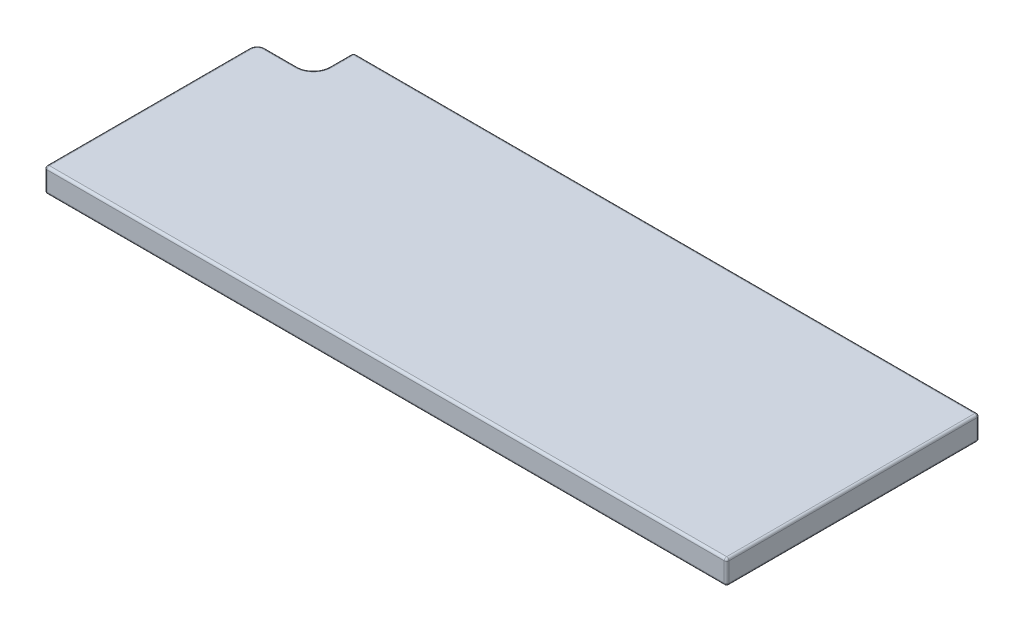
ISO-10303-21;
HEADER;
FILE_DESCRIPTION(('STEP AP214'),'2;1');
FILE_NAME('part.step','',(''),(''),'','','');
FILE_SCHEMA(('AUTOMOTIVE_DESIGN { 1 0 10303 214 1 1 1 1 }'));
ENDSEC;
DATA;
#1=APPLICATION_CONTEXT('core data for automotive mechanical design processes');
#2=APPLICATION_PROTOCOL_DEFINITION('international standard','automotive_design',2000,#1);
#3=PRODUCT_CONTEXT('',#1,'mechanical');
#4=PRODUCT('Part','Part','',(#3));
#5=PRODUCT_RELATED_PRODUCT_CATEGORY('part','',(#4));
#6=PRODUCT_DEFINITION_FORMATION('','',#4);
#7=PRODUCT_DEFINITION_CONTEXT('part definition',#1,'design');
#8=PRODUCT_DEFINITION('design','',#6,#7);
#9=PRODUCT_DEFINITION_SHAPE('','',#8);
#10=(LENGTH_UNIT() NAMED_UNIT(*) SI_UNIT(.MILLI.,.METRE.));
#11=(NAMED_UNIT(*) PLANE_ANGLE_UNIT() SI_UNIT($,.RADIAN.));
#12=(NAMED_UNIT(*) SI_UNIT($,.STERADIAN.) SOLID_ANGLE_UNIT());
#13=UNCERTAINTY_MEASURE_WITH_UNIT(LENGTH_MEASURE(1.E-05),#10,'distance_accuracy_value','');
#14=(GEOMETRIC_REPRESENTATION_CONTEXT(3) GLOBAL_UNCERTAINTY_ASSIGNED_CONTEXT((#13)) GLOBAL_UNIT_ASSIGNED_CONTEXT((#10,
#11,#12)) REPRESENTATION_CONTEXT('',''));
#15=CARTESIAN_POINT('',(0.,0.,0.));
#16=DIRECTION('',(0.,0.,1.));
#17=DIRECTION('',(1.,0.,0.));
#18=AXIS2_PLACEMENT_3D('',#15,#16,#17);
#19=CARTESIAN_POINT('',(425.,30.,-200.));
#20=DIRECTION('',(-1.,0.,0.));
#21=DIRECTION('',(0.,0.,1.));
#22=AXIS2_PLACEMENT_3D('',#19,#20,#21);
#23=PLANE('',#22);
#24=DIRECTION('',(0.,-1.,0.));
#25=VECTOR('',#24,1.);
#26=CARTESIAN_POINT('',(425.,30.,112.));
#27=LINE('',#26,#25);
#28=CARTESIAN_POINT('',(425.,27.,112.));
#29=VERTEX_POINT('',#28);
#30=CARTESIAN_POINT('',(425.,3.,112.));
#31=VERTEX_POINT('',#30);
#32=EDGE_CURVE('E229',#29,#31,#27,.T.);
#33=ORIENTED_EDGE('',*,*,#32,.T.);
#34=DIRECTION('',(0.,0.,-1.));
#35=VECTOR('',#34,1.);
#36=CARTESIAN_POINT('',(425.,3.,-200.));
#37=LINE('',#36,#35);
#38=CARTESIAN_POINT('',(425.,3.,-197.));
#39=VERTEX_POINT('',#38);
#40=EDGE_CURVE('E234',#31,#39,#37,.T.);
#41=ORIENTED_EDGE('',*,*,#40,.T.);
#42=DIRECTION('',(0.,-1.,0.));
#43=VECTOR('',#42,1.);
#44=CARTESIAN_POINT('',(425.,30.,-197.));
#45=LINE('',#44,#43);
#46=CARTESIAN_POINT('',(425.,27.,-197.));
#47=VERTEX_POINT('',#46);
#48=EDGE_CURVE('E231',#39,#47,#45,.F.);
#49=ORIENTED_EDGE('',*,*,#48,.T.);
#50=DIRECTION('',(0.,0.,-1.));
#51=VECTOR('',#50,1.);
#52=CARTESIAN_POINT('',(425.,27.,-200.));
#53=LINE('',#52,#51);
#54=EDGE_CURVE('E227',#47,#29,#53,.F.);
#55=ORIENTED_EDGE('',*,*,#54,.T.);
#56=EDGE_LOOP('',(#33,#41,#49,#55));
#57=FACE_BOUND('',#56,.T.);
#58=ADVANCED_FACE('F38',(#57),#23,.F.);
#59=CARTESIAN_POINT('',(-355.,30.,-200.));
#60=DIRECTION('',(0.,0.,1.));
#61=DIRECTION('',(1.,0.,0.));
#62=AXIS2_PLACEMENT_3D('',#59,#60,#61);
#63=PLANE('',#62);
#64=DIRECTION('',(0.,-1.,0.));
#65=VECTOR('',#64,1.);
#66=CARTESIAN_POINT('',(422.,30.,-200.));
#67=LINE('',#66,#65);
#68=CARTESIAN_POINT('',(422.,27.,-200.));
#69=VERTEX_POINT('',#68);
#70=CARTESIAN_POINT('',(422.,3.,-200.));
#71=VERTEX_POINT('',#70);
#72=EDGE_CURVE('E220',#69,#71,#67,.T.);
#73=ORIENTED_EDGE('',*,*,#72,.T.);
#74=DIRECTION('',(-1.,0.,0.));
#75=VECTOR('',#74,1.);
#76=CARTESIAN_POINT('',(-355.,3.,-200.));
#77=LINE('',#76,#75);
#78=CARTESIAN_POINT('',(-352.,3.,-200.));
#79=VERTEX_POINT('',#78);
#80=EDGE_CURVE('E225',#71,#79,#77,.T.);
#81=ORIENTED_EDGE('',*,*,#80,.T.);
#82=DIRECTION('',(0.,-1.,0.));
#83=VECTOR('',#82,1.);
#84=CARTESIAN_POINT('',(-352.,30.,-200.));
#85=LINE('',#84,#83);
#86=CARTESIAN_POINT('',(-352.,27.,-200.));
#87=VERTEX_POINT('',#86);
#88=EDGE_CURVE('E222',#79,#87,#85,.F.);
#89=ORIENTED_EDGE('',*,*,#88,.T.);
#90=DIRECTION('',(-1.,0.,0.));
#91=VECTOR('',#90,1.);
#92=CARTESIAN_POINT('',(-355.,27.,-200.));
#93=LINE('',#92,#91);
#94=EDGE_CURVE('E218',#87,#69,#93,.F.);
#95=ORIENTED_EDGE('',*,*,#94,.T.);
#96=EDGE_LOOP('',(#73,#81,#89,#95));
#97=FACE_BOUND('',#96,.T.);
#98=ADVANCED_FACE('F447',(#97),#63,.F.);
#99=CARTESIAN_POINT('',(-355.,30.,-200.));
#100=DIRECTION('',(1.,0.,0.));
#101=DIRECTION('',(0.,0.,-1.));
#102=AXIS2_PLACEMENT_3D('',#99,#100,#101);
#103=PLANE('',#102);
#104=DIRECTION('',(0.,-1.,0.));
#105=VECTOR('',#104,1.);
#106=CARTESIAN_POINT('',(-355.,30.,-197.));
#107=LINE('',#106,#105);
#108=CARTESIAN_POINT('',(-355.,27.,-197.));
#109=VERTEX_POINT('',#108);
#110=CARTESIAN_POINT('',(-355.,3.,-197.));
#111=VERTEX_POINT('',#110);
#112=EDGE_CURVE('E212',#109,#111,#107,.T.);
#113=ORIENTED_EDGE('',*,*,#112,.T.);
#114=DIRECTION('',(0.,0.,1.));
#115=VECTOR('',#114,1.);
#116=CARTESIAN_POINT('',(-355.,3.,-170.));
#117=LINE('',#116,#115);
#118=CARTESIAN_POINT('',(-355.,3.,-170.));
#119=VERTEX_POINT('',#118);
#120=EDGE_CURVE('E196',#111,#119,#117,.T.);
#121=ORIENTED_EDGE('',*,*,#120,.T.);
#122=DIRECTION('',(0.,-1.,0.));
#123=VECTOR('',#122,1.);
#124=CARTESIAN_POINT('',(-355.,30.,-170.));
#125=LINE('',#124,#123);
#126=CARTESIAN_POINT('',(-355.,27.,-170.));
#127=VERTEX_POINT('',#126);
#128=EDGE_CURVE('E178',#127,#119,#125,.T.);
#129=ORIENTED_EDGE('',*,*,#128,.F.);
#130=DIRECTION('',(0.,0.,1.));
#131=VECTOR('',#130,1.);
#132=CARTESIAN_POINT('',(-355.,27.,-200.));
#133=LINE('',#132,#131);
#134=EDGE_CURVE('E193',#127,#109,#133,.F.);
#135=ORIENTED_EDGE('',*,*,#134,.T.);
#136=EDGE_LOOP('',(#113,#121,#129,#135));
#137=FACE_BOUND('',#136,.T.);
#138=ADVANCED_FACE('F191',(#137),#103,.F.);
#139=CARTESIAN_POINT('',(-375.,30.,-170.));
#140=DIRECTION('',(0.,-1.,0.));
#141=DIRECTION('',(0.,0.,-1.));
#142=AXIS2_PLACEMENT_3D('',#139,#140,#141);
#143=CYLINDRICAL_SURFACE('',#142,20.);
#144=ORIENTED_EDGE('',*,*,#128,.T.);
#145=CARTESIAN_POINT('',(-375.,3.,-170.));
#146=DIRECTION('',(0.,-1.,0.));
#147=DIRECTION('',(0.,0.,-1.));
#148=AXIS2_PLACEMENT_3D('',#145,#146,#147);
#149=CIRCLE('',#148,20.);
#150=CARTESIAN_POINT('',(-375.,3.,-150.));
#151=VERTEX_POINT('',#150);
#152=EDGE_CURVE('E186',#119,#151,#149,.T.);
#153=ORIENTED_EDGE('',*,*,#152,.T.);
#154=DIRECTION('',(0.,-1.,0.));
#155=VECTOR('',#154,1.);
#156=CARTESIAN_POINT('',(-375.,30.,-150.));
#157=LINE('',#156,#155);
#158=CARTESIAN_POINT('',(-375.,27.,-150.));
#159=VERTEX_POINT('',#158);
#160=EDGE_CURVE('E181',#159,#151,#157,.T.);
#161=ORIENTED_EDGE('',*,*,#160,.F.);
#162=CARTESIAN_POINT('',(-375.,27.,-170.));
#163=DIRECTION('',(0.,-1.,0.));
#164=DIRECTION('',(0.,0.,-1.));
#165=AXIS2_PLACEMENT_3D('',#162,#163,#164);
#166=CIRCLE('',#165,20.);
#167=EDGE_CURVE('E175',#159,#127,#166,.F.);
#168=ORIENTED_EDGE('',*,*,#167,.T.);
#169=EDGE_LOOP('',(#144,#153,#161,#168));
#170=FACE_BOUND('',#169,.T.);
#171=ADVANCED_FACE('F177',(#170),#143,.F.);
#172=CARTESIAN_POINT('',(-415.,30.,-150.));
#173=DIRECTION('',(0.,0.,1.));
#174=DIRECTION('',(1.,0.,0.));
#175=AXIS2_PLACEMENT_3D('',#172,#173,#174);
#176=PLANE('',#175);
#177=ORIENTED_EDGE('',*,*,#160,.T.);
#178=DIRECTION('',(-1.,0.,0.));
#179=VECTOR('',#178,1.);
#180=CARTESIAN_POINT('',(-415.,3.,-150.));
#181=LINE('',#180,#179);
#182=CARTESIAN_POINT('',(-415.,3.,-150.));
#183=VERTEX_POINT('',#182);
#184=EDGE_CURVE('E270',#151,#183,#181,.T.);
#185=ORIENTED_EDGE('',*,*,#184,.T.);
#186=DIRECTION('',(0.,-1.,0.));
#187=VECTOR('',#186,1.);
#188=CARTESIAN_POINT('',(-415.,30.,-150.));
#189=LINE('',#188,#187);
#190=CARTESIAN_POINT('',(-415.,27.,-150.));
#191=VERTEX_POINT('',#190);
#192=EDGE_CURVE('E376',#191,#183,#189,.T.);
#193=ORIENTED_EDGE('',*,*,#192,.F.);
#194=DIRECTION('',(-1.,0.,0.));
#195=VECTOR('',#194,1.);
#196=CARTESIAN_POINT('',(-415.,27.,-150.));
#197=LINE('',#196,#195);
#198=EDGE_CURVE('E268',#191,#159,#197,.F.);
#199=ORIENTED_EDGE('',*,*,#198,.T.);
#200=EDGE_LOOP('',(#177,#185,#193,#199));
#201=FACE_BOUND('',#200,.T.);
#202=ADVANCED_FACE('F385',(#201),#176,.F.);
#203=CARTESIAN_POINT('',(-415.,30.,-140.));
#204=DIRECTION('',(0.,-1.,0.));
#205=DIRECTION('',(0.,0.,-1.));
#206=AXIS2_PLACEMENT_3D('',#203,#204,#205);
#207=CYLINDRICAL_SURFACE('',#206,10.);
#208=ORIENTED_EDGE('',*,*,#192,.T.);
#209=CARTESIAN_POINT('',(-415.,3.,-140.));
#210=DIRECTION('',(0.,-1.,0.));
#211=DIRECTION('',(0.,0.,-1.));
#212=AXIS2_PLACEMENT_3D('',#209,#210,#211);
#213=CIRCLE('',#212,10.);
#214=CARTESIAN_POINT('',(-425.,3.,-140.));
#215=VERTEX_POINT('',#214);
#216=EDGE_CURVE('E274',#183,#215,#213,.F.);
#217=ORIENTED_EDGE('',*,*,#216,.T.);
#218=DIRECTION('',(0.,-1.,0.));
#219=VECTOR('',#218,1.);
#220=CARTESIAN_POINT('',(-425.,30.,-140.));
#221=LINE('',#220,#219);
#222=CARTESIAN_POINT('',(-425.,27.,-140.));
#223=VERTEX_POINT('',#222);
#224=EDGE_CURVE('E370',#223,#215,#221,.T.);
#225=ORIENTED_EDGE('',*,*,#224,.F.);
#226=CARTESIAN_POINT('',(-415.,27.,-140.));
#227=DIRECTION('',(0.,-1.,0.));
#228=DIRECTION('',(0.,0.,-1.));
#229=AXIS2_PLACEMENT_3D('',#226,#227,#228);
#230=CIRCLE('',#229,10.);
#231=EDGE_CURVE('E272',#223,#191,#230,.T.);
#232=ORIENTED_EDGE('',*,*,#231,.T.);
#233=EDGE_LOOP('',(#208,#217,#225,#232));
#234=FACE_BOUND('',#233,.T.);
#235=ADVANCED_FACE('F408',(#234),#207,.T.);
#236=CARTESIAN_POINT('',(-425.,30.,-140.));
#237=DIRECTION('',(1.,0.,0.));
#238=DIRECTION('',(0.,0.,-1.));
#239=AXIS2_PLACEMENT_3D('',#236,#237,#238);
#240=PLANE('',#239);
#241=ORIENTED_EDGE('',*,*,#224,.T.);
#242=DIRECTION('',(0.,0.,1.));
#243=VECTOR('',#242,1.);
#244=CARTESIAN_POINT('',(-425.,3.,115.));
#245=LINE('',#244,#243);
#246=CARTESIAN_POINT('',(-425.,3.,112.));
#247=VERTEX_POINT('',#246);
#248=EDGE_CURVE('E249',#215,#247,#245,.T.);
#249=ORIENTED_EDGE('',*,*,#248,.T.);
#250=DIRECTION('',(0.,-1.,0.));
#251=VECTOR('',#250,1.);
#252=CARTESIAN_POINT('',(-425.,30.,112.));
#253=LINE('',#252,#251);
#254=CARTESIAN_POINT('',(-425.,27.,112.));
#255=VERTEX_POINT('',#254);
#256=EDGE_CURVE('E247',#247,#255,#253,.F.);
#257=ORIENTED_EDGE('',*,*,#256,.T.);
#258=DIRECTION('',(0.,0.,1.));
#259=VECTOR('',#258,1.);
#260=CARTESIAN_POINT('',(-425.,27.,-140.));
#261=LINE('',#260,#259);
#262=EDGE_CURVE('E245',#255,#223,#261,.F.);
#263=ORIENTED_EDGE('',*,*,#262,.T.);
#264=EDGE_LOOP('',(#241,#249,#257,#263));
#265=FACE_BOUND('',#264,.T.);
#266=ADVANCED_FACE('F756',(#265),#240,.F.);
#267=CARTESIAN_POINT('',(-425.,30.,115.));
#268=DIRECTION('',(0.,0.,-1.));
#269=DIRECTION('',(-1.,0.,0.));
#270=AXIS2_PLACEMENT_3D('',#267,#268,#269);
#271=PLANE('',#270);
#272=DIRECTION('',(0.,-1.,0.));
#273=VECTOR('',#272,1.);
#274=CARTESIAN_POINT('',(-422.,30.,115.));
#275=LINE('',#274,#273);
#276=CARTESIAN_POINT('',(-422.,27.,115.));
#277=VERTEX_POINT('',#276);
#278=CARTESIAN_POINT('',(-422.,3.,115.));
#279=VERTEX_POINT('',#278);
#280=EDGE_CURVE('E240',#277,#279,#275,.T.);
#281=ORIENTED_EDGE('',*,*,#280,.T.);
#282=DIRECTION('',(1.,0.,0.));
#283=VECTOR('',#282,1.);
#284=CARTESIAN_POINT('',(425.,3.,115.));
#285=LINE('',#284,#283);
#286=CARTESIAN_POINT('',(422.,3.,115.));
#287=VERTEX_POINT('',#286);
#288=EDGE_CURVE('E243',#279,#287,#285,.T.);
#289=ORIENTED_EDGE('',*,*,#288,.T.);
#290=DIRECTION('',(0.,-1.,0.));
#291=VECTOR('',#290,1.);
#292=CARTESIAN_POINT('',(422.,30.,115.));
#293=LINE('',#292,#291);
#294=CARTESIAN_POINT('',(422.,27.,115.));
#295=VERTEX_POINT('',#294);
#296=EDGE_CURVE('E238',#287,#295,#293,.F.);
#297=ORIENTED_EDGE('',*,*,#296,.T.);
#298=DIRECTION('',(1.,0.,0.));
#299=VECTOR('',#298,1.);
#300=CARTESIAN_POINT('',(-425.,27.,115.));
#301=LINE('',#300,#299);
#302=EDGE_CURVE('E236',#295,#277,#301,.F.);
#303=ORIENTED_EDGE('',*,*,#302,.T.);
#304=EDGE_LOOP('',(#281,#289,#297,#303));
#305=FACE_BOUND('',#304,.T.);
#306=ADVANCED_FACE('F746',(#305),#271,.F.);
#307=CARTESIAN_POINT('',(-415.,30.,-140.));
#308=DIRECTION('',(0.,-1.,0.));
#309=DIRECTION('',(0.,0.,-1.));
#310=AXIS2_PLACEMENT_3D('',#307,#308,#309);
#311=PLANE('',#310);
#312=DIRECTION('',(0.,0.,1.));
#313=VECTOR('',#312,1.);
#314=CARTESIAN_POINT('',(-422.,30.,-140.));
#315=LINE('',#314,#313);
#316=CARTESIAN_POINT('',(-422.,30.,-140.));
#317=VERTEX_POINT('',#316);
#318=CARTESIAN_POINT('',(-422.,30.,112.));
#319=VERTEX_POINT('',#318);
#320=EDGE_CURVE('E47',#317,#319,#315,.T.);
#321=ORIENTED_EDGE('',*,*,#320,.T.);
#322=DIRECTION('',(1.,0.,0.));
#323=VECTOR('',#322,1.);
#324=CARTESIAN_POINT('',(-415.,30.,112.));
#325=LINE('',#324,#323);
#326=CARTESIAN_POINT('',(422.,30.,112.));
#327=VERTEX_POINT('',#326);
#328=EDGE_CURVE('E11',#319,#327,#325,.T.);
#329=ORIENTED_EDGE('',*,*,#328,.T.);
#330=DIRECTION('',(0.,0.,-1.));
#331=VECTOR('',#330,1.);
#332=CARTESIAN_POINT('',(422.,30.,-140.));
#333=LINE('',#332,#331);
#334=CARTESIAN_POINT('',(422.,30.,-197.));
#335=VERTEX_POINT('',#334);
#336=EDGE_CURVE('E276',#327,#335,#333,.T.);
#337=ORIENTED_EDGE('',*,*,#336,.T.);
#338=DIRECTION('',(-1.,0.,0.));
#339=VECTOR('',#338,1.);
#340=CARTESIAN_POINT('',(-415.,30.,-197.));
#341=LINE('',#340,#339);
#342=CARTESIAN_POINT('',(-352.,30.,-197.));
#343=VERTEX_POINT('',#342);
#344=EDGE_CURVE('E278',#335,#343,#341,.T.);
#345=ORIENTED_EDGE('',*,*,#344,.T.);
#346=DIRECTION('',(0.,0.,1.));
#347=VECTOR('',#346,1.);
#348=CARTESIAN_POINT('',(-352.,30.,-140.));
#349=LINE('',#348,#347);
#350=CARTESIAN_POINT('',(-352.,30.,-170.));
#351=VERTEX_POINT('',#350);
#352=EDGE_CURVE('E280',#343,#351,#349,.T.);
#353=ORIENTED_EDGE('',*,*,#352,.T.);
#354=CARTESIAN_POINT('',(-375.,30.,-170.));
#355=DIRECTION('',(0.,-1.,0.));
#356=DIRECTION('',(0.,0.,-1.));
#357=AXIS2_PLACEMENT_3D('',#354,#355,#356);
#358=CIRCLE('',#357,23.);
#359=CARTESIAN_POINT('',(-375.,30.,-147.));
#360=VERTEX_POINT('',#359);
#361=EDGE_CURVE('E202',#351,#360,#358,.T.);
#362=ORIENTED_EDGE('',*,*,#361,.T.);
#363=DIRECTION('',(-1.,0.,0.));
#364=VECTOR('',#363,1.);
#365=CARTESIAN_POINT('',(-415.,30.,-147.));
#366=LINE('',#365,#364);
#367=CARTESIAN_POINT('',(-415.,30.,-147.));
#368=VERTEX_POINT('',#367);
#369=EDGE_CURVE('E283',#360,#368,#366,.T.);
#370=ORIENTED_EDGE('',*,*,#369,.T.);
#371=CARTESIAN_POINT('',(-415.,30.,-140.));
#372=DIRECTION('',(0.,-1.,0.));
#373=DIRECTION('',(0.,0.,-1.));
#374=AXIS2_PLACEMENT_3D('',#371,#372,#373);
#375=CIRCLE('',#374,7.00000000000001);
#376=EDGE_CURVE('E58',#368,#317,#375,.F.);
#377=ORIENTED_EDGE('',*,*,#376,.T.);
#378=EDGE_LOOP('',(#321,#329,#337,#345,#353,#362,#370,#377));
#379=FACE_BOUND('',#378,.T.);
#380=ADVANCED_FACE('F417',(#379),#311,.F.);
#381=CARTESIAN_POINT('',(-415.,0.,-140.));
#382=DIRECTION('',(0.,-1.,0.));
#383=DIRECTION('',(0.,0.,-1.));
#384=AXIS2_PLACEMENT_3D('',#381,#382,#383);
#385=PLANE('',#384);
#386=DIRECTION('',(0.,0.,1.));
#387=VECTOR('',#386,1.);
#388=CARTESIAN_POINT('',(-352.,0.,-200.));
#389=LINE('',#388,#387);
#390=CARTESIAN_POINT('',(-352.,0.,-170.));
#391=VERTEX_POINT('',#390);
#392=CARTESIAN_POINT('',(-352.,0.,-197.));
#393=VERTEX_POINT('',#392);
#394=EDGE_CURVE('E263',#391,#393,#389,.F.);
#395=ORIENTED_EDGE('',*,*,#394,.T.);
#396=DIRECTION('',(-1.,0.,0.));
#397=VECTOR('',#396,1.);
#398=CARTESIAN_POINT('',(425.,0.,-197.));
#399=LINE('',#398,#397);
#400=CARTESIAN_POINT('',(422.,0.,-197.));
#401=VERTEX_POINT('',#400);
#402=EDGE_CURVE('E187',#393,#401,#399,.F.);
#403=ORIENTED_EDGE('',*,*,#402,.T.);
#404=DIRECTION('',(0.,0.,-1.));
#405=VECTOR('',#404,1.);
#406=CARTESIAN_POINT('',(422.,0.,115.));
#407=LINE('',#406,#405);
#408=CARTESIAN_POINT('',(422.,0.,112.));
#409=VERTEX_POINT('',#408);
#410=EDGE_CURVE('E251',#401,#409,#407,.F.);
#411=ORIENTED_EDGE('',*,*,#410,.T.);
#412=DIRECTION('',(1.,0.,0.));
#413=VECTOR('',#412,1.);
#414=CARTESIAN_POINT('',(-425.,0.,112.));
#415=LINE('',#414,#413);
#416=CARTESIAN_POINT('',(-422.,0.,112.));
#417=VERTEX_POINT('',#416);
#418=EDGE_CURVE('E253',#409,#417,#415,.F.);
#419=ORIENTED_EDGE('',*,*,#418,.T.);
#420=DIRECTION('',(0.,0.,1.));
#421=VECTOR('',#420,1.);
#422=CARTESIAN_POINT('',(-422.,0.,-140.));
#423=LINE('',#422,#421);
#424=CARTESIAN_POINT('',(-422.,0.,-140.));
#425=VERTEX_POINT('',#424);
#426=EDGE_CURVE('E255',#417,#425,#423,.F.);
#427=ORIENTED_EDGE('',*,*,#426,.T.);
#428=CARTESIAN_POINT('',(-415.,0.,-140.));
#429=DIRECTION('',(0.,-1.,0.));
#430=DIRECTION('',(0.,0.,-1.));
#431=AXIS2_PLACEMENT_3D('',#428,#429,#430);
#432=CIRCLE('',#431,7.00000000000001);
#433=CARTESIAN_POINT('',(-415.,0.,-147.));
#434=VERTEX_POINT('',#433);
#435=EDGE_CURVE('E257',#425,#434,#432,.T.);
#436=ORIENTED_EDGE('',*,*,#435,.T.);
#437=DIRECTION('',(-1.,0.,0.));
#438=VECTOR('',#437,1.);
#439=CARTESIAN_POINT('',(-375.,0.,-147.));
#440=LINE('',#439,#438);
#441=CARTESIAN_POINT('',(-375.,0.,-147.));
#442=VERTEX_POINT('',#441);
#443=EDGE_CURVE('E259',#434,#442,#440,.F.);
#444=ORIENTED_EDGE('',*,*,#443,.T.);
#445=CARTESIAN_POINT('',(-375.,0.,-170.));
#446=DIRECTION('',(0.,-1.,0.));
#447=DIRECTION('',(0.,0.,-1.));
#448=AXIS2_PLACEMENT_3D('',#445,#446,#447);
#449=CIRCLE('',#448,23.);
#450=EDGE_CURVE('E261',#442,#391,#449,.F.);
#451=ORIENTED_EDGE('',*,*,#450,.T.);
#452=EDGE_LOOP('',(#395,#403,#411,#419,#427,#436,#444,#451));
#453=FACE_BOUND('',#452,.T.);
#454=ADVANCED_FACE('F399',(#453),#385,.T.);
#455=CARTESIAN_POINT('',(-422.,30.,112.));
#456=DIRECTION('',(0.,-1.,0.));
#457=DIRECTION('',(0.,0.,-1.));
#458=AXIS2_PLACEMENT_3D('',#455,#456,#457);
#459=CYLINDRICAL_SURFACE('',#458,3.);
#460=CARTESIAN_POINT('',(-422.,27.,112.));
#461=DIRECTION('',(0.,1.,0.));
#462=DIRECTION('',(0.,0.,1.));
#463=AXIS2_PLACEMENT_3D('',#460,#461,#462);
#464=CIRCLE('',#463,3.);
#465=EDGE_CURVE('E42',#255,#277,#464,.T.);
#466=ORIENTED_EDGE('',*,*,#465,.F.);
#467=ORIENTED_EDGE('',*,*,#256,.F.);
#468=CARTESIAN_POINT('',(-422.,3.,112.));
#469=DIRECTION('',(0.,-1.,0.));
#470=DIRECTION('',(0.,0.,-1.));
#471=AXIS2_PLACEMENT_3D('',#468,#469,#470);
#472=CIRCLE('',#471,3.);
#473=EDGE_CURVE('E363',#279,#247,#472,.T.);
#474=ORIENTED_EDGE('',*,*,#473,.F.);
#475=ORIENTED_EDGE('',*,*,#280,.F.);
#476=EDGE_LOOP('',(#466,#467,#474,#475));
#477=FACE_BOUND('',#476,.T.);
#478=ADVANCED_FACE('F40',(#477),#459,.T.);
#479=CARTESIAN_POINT('',(-422.,27.,112.));
#480=DIRECTION('',(0.,0.,1.));
#481=DIRECTION('',(1.,0.,0.));
#482=AXIS2_PLACEMENT_3D('',#479,#480,#481);
#483=SPHERICAL_SURFACE('',#482,3.);
#484=CARTESIAN_POINT('',(-422.,27.,112.));
#485=DIRECTION('',(0.,0.,1.));
#486=DIRECTION('',(1.,0.,0.));
#487=AXIS2_PLACEMENT_3D('',#484,#485,#486);
#488=CIRCLE('',#487,3.);
#489=EDGE_CURVE('E359',#255,#319,#488,.F.);
#490=ORIENTED_EDGE('',*,*,#489,.F.);
#491=ORIENTED_EDGE('',*,*,#465,.T.);
#492=CARTESIAN_POINT('',(-422.,27.,112.));
#493=DIRECTION('',(-1.,0.,0.));
#494=DIRECTION('',(0.,0.,1.));
#495=AXIS2_PLACEMENT_3D('',#492,#493,#494);
#496=CIRCLE('',#495,3.);
#497=EDGE_CURVE('E361',#319,#277,#496,.F.);
#498=ORIENTED_EDGE('',*,*,#497,.F.);
#499=EDGE_LOOP('',(#490,#491,#498));
#500=FACE_BOUND('',#499,.T.);
#501=ADVANCED_FACE('F710',(#500),#483,.T.);
#502=CARTESIAN_POINT('',(-422.,3.,112.));
#503=DIRECTION('',(-1.,0.,0.));
#504=DIRECTION('',(0.,-1.,0.));
#505=AXIS2_PLACEMENT_3D('',#502,#503,#504);
#506=SPHERICAL_SURFACE('',#505,3.);
#507=CARTESIAN_POINT('',(-422.,3.,112.));
#508=DIRECTION('',(-1.,0.,0.));
#509=DIRECTION('',(0.,0.,1.));
#510=AXIS2_PLACEMENT_3D('',#507,#508,#509);
#511=CIRCLE('',#510,3.);
#512=EDGE_CURVE('E353',#279,#417,#511,.F.);
#513=ORIENTED_EDGE('',*,*,#512,.F.);
#514=ORIENTED_EDGE('',*,*,#473,.T.);
#515=CARTESIAN_POINT('',(-422.,3.,112.));
#516=DIRECTION('',(0.,0.,1.));
#517=DIRECTION('',(1.,0.,0.));
#518=AXIS2_PLACEMENT_3D('',#515,#516,#517);
#519=CIRCLE('',#518,3.);
#520=EDGE_CURVE('E356',#417,#247,#519,.F.);
#521=ORIENTED_EDGE('',*,*,#520,.F.);
#522=EDGE_LOOP('',(#513,#514,#521));
#523=FACE_BOUND('',#522,.T.);
#524=ADVANCED_FACE('F699',(#523),#506,.T.);
#525=CARTESIAN_POINT('',(-415.,27.,112.));
#526=DIRECTION('',(1.,0.,0.));
#527=DIRECTION('',(0.,0.,-1.));
#528=AXIS2_PLACEMENT_3D('',#525,#526,#527);
#529=CYLINDRICAL_SURFACE('',#528,3.);
#530=ORIENTED_EDGE('',*,*,#497,.T.);
#531=ORIENTED_EDGE('',*,*,#302,.F.);
#532=CARTESIAN_POINT('',(422.,27.,112.));
#533=DIRECTION('',(1.,0.,0.));
#534=DIRECTION('',(0.,0.,-1.));
#535=AXIS2_PLACEMENT_3D('',#532,#533,#534);
#536=CIRCLE('',#535,3.);
#537=EDGE_CURVE('E347',#327,#295,#536,.T.);
#538=ORIENTED_EDGE('',*,*,#537,.F.);
#539=ORIENTED_EDGE('',*,*,#328,.F.);
#540=EDGE_LOOP('',(#530,#531,#538,#539));
#541=FACE_BOUND('',#540,.T.);
#542=ADVANCED_FACE('F688',(#541),#529,.T.);
#543=CARTESIAN_POINT('',(-422.,27.,-140.));
#544=DIRECTION('',(0.,0.,1.));
#545=DIRECTION('',(1.,0.,0.));
#546=AXIS2_PLACEMENT_3D('',#543,#544,#545);
#547=CYLINDRICAL_SURFACE('',#546,3.);
#548=ORIENTED_EDGE('',*,*,#489,.T.);
#549=ORIENTED_EDGE('',*,*,#320,.F.);
#550=CARTESIAN_POINT('',(-422.,27.,-140.));
#551=DIRECTION('',(0.,0.,-1.));
#552=DIRECTION('',(-1.,0.,0.));
#553=AXIS2_PLACEMENT_3D('',#550,#551,#552);
#554=CIRCLE('',#553,3.);
#555=EDGE_CURVE('E344',#223,#317,#554,.T.);
#556=ORIENTED_EDGE('',*,*,#555,.F.);
#557=ORIENTED_EDGE('',*,*,#262,.F.);
#558=EDGE_LOOP('',(#548,#549,#556,#557));
#559=FACE_BOUND('',#558,.T.);
#560=ADVANCED_FACE('F677',(#559),#547,.T.);
#561=CARTESIAN_POINT('',(-422.,3.,-140.));
#562=DIRECTION('',(0.,0.,-1.));
#563=DIRECTION('',(-1.,0.,0.));
#564=AXIS2_PLACEMENT_3D('',#561,#562,#563);
#565=CYLINDRICAL_SURFACE('',#564,3.);
#566=ORIENTED_EDGE('',*,*,#520,.T.);
#567=ORIENTED_EDGE('',*,*,#248,.F.);
#568=CARTESIAN_POINT('',(-422.,3.,-140.));
#569=DIRECTION('',(0.,0.,-1.));
#570=DIRECTION('',(-1.,0.,0.));
#571=AXIS2_PLACEMENT_3D('',#568,#569,#570);
#572=CIRCLE('',#571,3.);
#573=EDGE_CURVE('E341',#425,#215,#572,.T.);
#574=ORIENTED_EDGE('',*,*,#573,.F.);
#575=ORIENTED_EDGE('',*,*,#426,.F.);
#576=EDGE_LOOP('',(#566,#567,#574,#575));
#577=FACE_BOUND('',#576,.T.);
#578=ADVANCED_FACE('F666',(#577),#565,.T.);
#579=CARTESIAN_POINT('',(-425.,3.,112.));
#580=DIRECTION('',(-1.,0.,0.));
#581=DIRECTION('',(0.,0.,1.));
#582=AXIS2_PLACEMENT_3D('',#579,#580,#581);
#583=CYLINDRICAL_SURFACE('',#582,3.);
#584=ORIENTED_EDGE('',*,*,#512,.T.);
#585=ORIENTED_EDGE('',*,*,#418,.F.);
#586=CARTESIAN_POINT('',(422.,3.,112.));
#587=DIRECTION('',(1.,0.,0.));
#588=DIRECTION('',(0.,0.,-1.));
#589=AXIS2_PLACEMENT_3D('',#586,#587,#588);
#590=CIRCLE('',#589,3.);
#591=EDGE_CURVE('E338',#287,#409,#590,.T.);
#592=ORIENTED_EDGE('',*,*,#591,.F.);
#593=ORIENTED_EDGE('',*,*,#288,.F.);
#594=EDGE_LOOP('',(#584,#585,#592,#593));
#595=FACE_BOUND('',#594,.T.);
#596=ADVANCED_FACE('F655',(#595),#583,.T.);
#597=CARTESIAN_POINT('',(422.,30.,112.));
#598=DIRECTION('',(0.,-1.,0.));
#599=DIRECTION('',(0.,0.,-1.));
#600=AXIS2_PLACEMENT_3D('',#597,#598,#599);
#601=CYLINDRICAL_SURFACE('',#600,3.);
#602=CARTESIAN_POINT('',(422.,27.,112.));
#603=DIRECTION('',(0.,1.,0.));
#604=DIRECTION('',(0.,0.,1.));
#605=AXIS2_PLACEMENT_3D('',#602,#603,#604);
#606=CIRCLE('',#605,3.);
#607=EDGE_CURVE('E350',#295,#29,#606,.T.);
#608=ORIENTED_EDGE('',*,*,#607,.F.);
#609=ORIENTED_EDGE('',*,*,#296,.F.);
#610=CARTESIAN_POINT('',(422.,3.,112.));
#611=DIRECTION('',(0.,-1.,0.));
#612=DIRECTION('',(0.,0.,-1.));
#613=AXIS2_PLACEMENT_3D('',#610,#611,#612);
#614=CIRCLE('',#613,3.);
#615=EDGE_CURVE('E335',#31,#287,#614,.T.);
#616=ORIENTED_EDGE('',*,*,#615,.F.);
#617=ORIENTED_EDGE('',*,*,#32,.F.);
#618=EDGE_LOOP('',(#608,#609,#616,#617));
#619=FACE_BOUND('',#618,.T.);
#620=ADVANCED_FACE('F644',(#619),#601,.T.);
#621=CARTESIAN_POINT('',(422.,27.,112.));
#622=DIRECTION('',(0.,0.,1.));
#623=DIRECTION('',(1.,0.,0.));
#624=AXIS2_PLACEMENT_3D('',#621,#622,#623);
#625=SPHERICAL_SURFACE('',#624,3.);
#626=ORIENTED_EDGE('',*,*,#537,.T.);
#627=ORIENTED_EDGE('',*,*,#607,.T.);
#628=CARTESIAN_POINT('',(422.,27.,112.));
#629=DIRECTION('',(0.,0.,1.));
#630=DIRECTION('',(1.,0.,0.));
#631=AXIS2_PLACEMENT_3D('',#628,#629,#630);
#632=CIRCLE('',#631,3.);
#633=EDGE_CURVE('E332',#327,#29,#632,.F.);
#634=ORIENTED_EDGE('',*,*,#633,.F.);
#635=EDGE_LOOP('',(#626,#627,#634));
#636=FACE_BOUND('',#635,.T.);
#637=ADVANCED_FACE('F634',(#636),#625,.T.);
#638=CARTESIAN_POINT('',(-415.,27.,-140.));
#639=DIRECTION('',(0.,-1.,0.));
#640=DIRECTION('',(0.,0.,-1.));
#641=AXIS2_PLACEMENT_3D('',#638,#639,#640);
#642=TOROIDAL_SURFACE('',#641,7.00000000000001,3.);
#643=ORIENTED_EDGE('',*,*,#555,.T.);
#644=ORIENTED_EDGE('',*,*,#376,.F.);
#645=CARTESIAN_POINT('',(-415.,27.,-147.));
#646=DIRECTION('',(1.,0.,0.));
#647=DIRECTION('',(0.,0.,-1.));
#648=AXIS2_PLACEMENT_3D('',#645,#646,#647);
#649=CIRCLE('',#648,3.);
#650=EDGE_CURVE('E329',#191,#368,#649,.T.);
#651=ORIENTED_EDGE('',*,*,#650,.F.);
#652=ORIENTED_EDGE('',*,*,#231,.F.);
#653=EDGE_LOOP('',(#643,#644,#651,#652));
#654=FACE_BOUND('',#653,.T.);
#655=ADVANCED_FACE('F413',(#654),#642,.T.);
#656=CARTESIAN_POINT('',(-415.,3.,-140.));
#657=DIRECTION('',(0.,-1.,0.));
#658=DIRECTION('',(0.,0.,-1.));
#659=AXIS2_PLACEMENT_3D('',#656,#657,#658);
#660=TOROIDAL_SURFACE('',#659,7.00000000000001,3.);
#661=ORIENTED_EDGE('',*,*,#573,.T.);
#662=ORIENTED_EDGE('',*,*,#216,.F.);
#663=CARTESIAN_POINT('',(-415.,3.,-147.));
#664=DIRECTION('',(1.,0.,0.));
#665=DIRECTION('',(0.,0.,-1.));
#666=AXIS2_PLACEMENT_3D('',#663,#664,#665);
#667=CIRCLE('',#666,3.);
#668=EDGE_CURVE('E326',#434,#183,#667,.T.);
#669=ORIENTED_EDGE('',*,*,#668,.F.);
#670=ORIENTED_EDGE('',*,*,#435,.F.);
#671=EDGE_LOOP('',(#661,#662,#669,#670));
#672=FACE_BOUND('',#671,.T.);
#673=ADVANCED_FACE('F406',(#672),#660,.T.);
#674=CARTESIAN_POINT('',(422.,3.,112.));
#675=DIRECTION('',(0.,0.,1.));
#676=DIRECTION('',(0.,-1.,0.));
#677=AXIS2_PLACEMENT_3D('',#674,#675,#676);
#678=SPHERICAL_SURFACE('',#677,3.);
#679=ORIENTED_EDGE('',*,*,#615,.T.);
#680=ORIENTED_EDGE('',*,*,#591,.T.);
#681=CARTESIAN_POINT('',(422.,3.,112.));
#682=DIRECTION('',(0.,0.,1.));
#683=DIRECTION('',(1.,0.,0.));
#684=AXIS2_PLACEMENT_3D('',#681,#682,#683);
#685=CIRCLE('',#684,3.);
#686=EDGE_CURVE('E323',#31,#409,#685,.F.);
#687=ORIENTED_EDGE('',*,*,#686,.F.);
#688=EDGE_LOOP('',(#679,#680,#687));
#689=FACE_BOUND('',#688,.T.);
#690=ADVANCED_FACE('F604',(#689),#678,.T.);
#691=CARTESIAN_POINT('',(422.,27.,-140.));
#692=DIRECTION('',(0.,0.,-1.));
#693=DIRECTION('',(-1.,0.,0.));
#694=AXIS2_PLACEMENT_3D('',#691,#692,#693);
#695=CYLINDRICAL_SURFACE('',#694,3.);
#696=ORIENTED_EDGE('',*,*,#633,.T.);
#697=ORIENTED_EDGE('',*,*,#54,.F.);
#698=CARTESIAN_POINT('',(422.,27.,-197.));
#699=DIRECTION('',(0.,0.,-1.));
#700=DIRECTION('',(-1.,0.,0.));
#701=AXIS2_PLACEMENT_3D('',#698,#699,#700);
#702=CIRCLE('',#701,3.);
#703=EDGE_CURVE('E318',#335,#47,#702,.T.);
#704=ORIENTED_EDGE('',*,*,#703,.F.);
#705=ORIENTED_EDGE('',*,*,#336,.F.);
#706=EDGE_LOOP('',(#696,#697,#704,#705));
#707=FACE_BOUND('',#706,.T.);
#708=ADVANCED_FACE('F594',(#707),#695,.T.);
#709=CARTESIAN_POINT('',(-415.,27.,-147.));
#710=DIRECTION('',(-1.,0.,0.));
#711=DIRECTION('',(0.,0.,1.));
#712=AXIS2_PLACEMENT_3D('',#709,#710,#711);
#713=CYLINDRICAL_SURFACE('',#712,3.);
#714=ORIENTED_EDGE('',*,*,#650,.T.);
#715=ORIENTED_EDGE('',*,*,#369,.F.);
#716=CARTESIAN_POINT('',(-375.,27.,-147.));
#717=DIRECTION('',(1.,0.,0.));
#718=DIRECTION('',(0.,0.,-1.));
#719=AXIS2_PLACEMENT_3D('',#716,#717,#718);
#720=CIRCLE('',#719,3.);
#721=EDGE_CURVE('E316',#159,#360,#720,.T.);
#722=ORIENTED_EDGE('',*,*,#721,.F.);
#723=ORIENTED_EDGE('',*,*,#198,.F.);
#724=EDGE_LOOP('',(#714,#715,#722,#723));
#725=FACE_BOUND('',#724,.T.);
#726=ADVANCED_FACE('F416',(#725),#713,.T.);
#727=CARTESIAN_POINT('',(-415.,3.,-147.));
#728=DIRECTION('',(1.,0.,0.));
#729=DIRECTION('',(0.,0.,-1.));
#730=AXIS2_PLACEMENT_3D('',#727,#728,#729);
#731=CYLINDRICAL_SURFACE('',#730,3.);
#732=ORIENTED_EDGE('',*,*,#668,.T.);
#733=ORIENTED_EDGE('',*,*,#184,.F.);
#734=CARTESIAN_POINT('',(-375.,3.,-147.));
#735=DIRECTION('',(1.,0.,0.));
#736=DIRECTION('',(0.,0.,-1.));
#737=AXIS2_PLACEMENT_3D('',#734,#735,#736);
#738=CIRCLE('',#737,3.);
#739=EDGE_CURVE('E313',#442,#151,#738,.T.);
#740=ORIENTED_EDGE('',*,*,#739,.F.);
#741=ORIENTED_EDGE('',*,*,#443,.F.);
#742=EDGE_LOOP('',(#732,#733,#740,#741));
#743=FACE_BOUND('',#742,.T.);
#744=ADVANCED_FACE('F390',(#743),#731,.T.);
#745=CARTESIAN_POINT('',(422.,3.,-200.));
#746=DIRECTION('',(0.,0.,1.));
#747=DIRECTION('',(1.,0.,0.));
#748=AXIS2_PLACEMENT_3D('',#745,#746,#747);
#749=CYLINDRICAL_SURFACE('',#748,3.);
#750=ORIENTED_EDGE('',*,*,#686,.T.);
#751=ORIENTED_EDGE('',*,*,#410,.F.);
#752=CARTESIAN_POINT('',(422.,3.,-197.));
#753=DIRECTION('',(0.,0.,-1.));
#754=DIRECTION('',(-1.,0.,0.));
#755=AXIS2_PLACEMENT_3D('',#752,#753,#754);
#756=CIRCLE('',#755,3.);
#757=EDGE_CURVE('E310',#39,#401,#756,.T.);
#758=ORIENTED_EDGE('',*,*,#757,.F.);
#759=ORIENTED_EDGE('',*,*,#40,.F.);
#760=EDGE_LOOP('',(#750,#751,#758,#759));
#761=FACE_BOUND('',#760,.T.);
#762=ADVANCED_FACE('F564',(#761),#749,.T.);
#763=CARTESIAN_POINT('',(422.,30.,-197.));
#764=DIRECTION('',(0.,-1.,0.));
#765=DIRECTION('',(0.,0.,-1.));
#766=AXIS2_PLACEMENT_3D('',#763,#764,#765);
#767=CYLINDRICAL_SURFACE('',#766,3.);
#768=CARTESIAN_POINT('',(422.,27.,-197.));
#769=DIRECTION('',(0.,1.,0.));
#770=DIRECTION('',(0.,0.,1.));
#771=AXIS2_PLACEMENT_3D('',#768,#769,#770);
#772=CIRCLE('',#771,3.);
#773=EDGE_CURVE('E320',#47,#69,#772,.T.);
#774=ORIENTED_EDGE('',*,*,#773,.F.);
#775=ORIENTED_EDGE('',*,*,#48,.F.);
#776=CARTESIAN_POINT('',(422.,3.,-197.));
#777=DIRECTION('',(0.,-1.,0.));
#778=DIRECTION('',(0.,0.,-1.));
#779=AXIS2_PLACEMENT_3D('',#776,#777,#778);
#780=CIRCLE('',#779,3.);
#781=EDGE_CURVE('E307',#71,#39,#780,.T.);
#782=ORIENTED_EDGE('',*,*,#781,.F.);
#783=ORIENTED_EDGE('',*,*,#72,.F.);
#784=EDGE_LOOP('',(#774,#775,#782,#783));
#785=FACE_BOUND('',#784,.T.);
#786=ADVANCED_FACE('F553',(#785),#767,.T.);
#787=CARTESIAN_POINT('',(422.,27.,-197.));
#788=DIRECTION('',(1.,0.,0.));
#789=DIRECTION('',(0.,0.,-1.));
#790=AXIS2_PLACEMENT_3D('',#787,#788,#789);
#791=SPHERICAL_SURFACE('',#790,3.);
#792=ORIENTED_EDGE('',*,*,#703,.T.);
#793=ORIENTED_EDGE('',*,*,#773,.T.);
#794=CARTESIAN_POINT('',(422.,27.,-197.));
#795=DIRECTION('',(1.,0.,0.));
#796=DIRECTION('',(0.,1.,0.));
#797=AXIS2_PLACEMENT_3D('',#794,#795,#796);
#798=CIRCLE('',#797,3.);
#799=EDGE_CURVE('E205',#335,#69,#798,.F.);
#800=ORIENTED_EDGE('',*,*,#799,.F.);
#801=EDGE_LOOP('',(#792,#793,#800));
#802=FACE_BOUND('',#801,.T.);
#803=ADVANCED_FACE('F543',(#802),#791,.T.);
#804=CARTESIAN_POINT('',(-375.,27.,-170.));
#805=DIRECTION('',(0.,-1.,0.));
#806=DIRECTION('',(0.,0.,-1.));
#807=AXIS2_PLACEMENT_3D('',#804,#805,#806);
#808=TOROIDAL_SURFACE('',#807,23.,3.);
#809=ORIENTED_EDGE('',*,*,#721,.T.);
#810=ORIENTED_EDGE('',*,*,#361,.F.);
#811=CARTESIAN_POINT('',(-352.,27.,-170.));
#812=DIRECTION('',(0.,0.,-1.));
#813=DIRECTION('',(-1.,0.,0.));
#814=AXIS2_PLACEMENT_3D('',#811,#812,#813);
#815=CIRCLE('',#814,3.);
#816=EDGE_CURVE('E200',#127,#351,#815,.T.);
#817=ORIENTED_EDGE('',*,*,#816,.F.);
#818=ORIENTED_EDGE('',*,*,#167,.F.);
#819=EDGE_LOOP('',(#809,#810,#817,#818));
#820=FACE_BOUND('',#819,.T.);
#821=ADVANCED_FACE('F201',(#820),#808,.T.);
#822=CARTESIAN_POINT('',(-375.,3.,-170.));
#823=DIRECTION('',(0.,-1.,0.));
#824=DIRECTION('',(0.,0.,-1.));
#825=AXIS2_PLACEMENT_3D('',#822,#823,#824);
#826=TOROIDAL_SURFACE('',#825,23.,3.);
#827=ORIENTED_EDGE('',*,*,#739,.T.);
#828=ORIENTED_EDGE('',*,*,#152,.F.);
#829=CARTESIAN_POINT('',(-352.,3.,-170.));
#830=DIRECTION('',(0.,0.,-1.));
#831=DIRECTION('',(-1.,0.,0.));
#832=AXIS2_PLACEMENT_3D('',#829,#830,#831);
#833=CIRCLE('',#832,3.);
#834=EDGE_CURVE('E206',#391,#119,#833,.T.);
#835=ORIENTED_EDGE('',*,*,#834,.F.);
#836=ORIENTED_EDGE('',*,*,#450,.F.);
#837=EDGE_LOOP('',(#827,#828,#835,#836));
#838=FACE_BOUND('',#837,.T.);
#839=ADVANCED_FACE('F395',(#838),#826,.T.);
#840=CARTESIAN_POINT('',(422.,3.,-197.));
#841=DIRECTION('',(1.,0.,0.));
#842=DIRECTION('',(0.,1.,0.));
#843=AXIS2_PLACEMENT_3D('',#840,#841,#842);
#844=SPHERICAL_SURFACE('',#843,3.);
#845=ORIENTED_EDGE('',*,*,#781,.T.);
#846=ORIENTED_EDGE('',*,*,#757,.T.);
#847=CARTESIAN_POINT('',(422.,3.,-197.));
#848=DIRECTION('',(1.,0.,0.));
#849=DIRECTION('',(0.,0.,-1.));
#850=AXIS2_PLACEMENT_3D('',#847,#848,#849);
#851=CIRCLE('',#850,3.);
#852=EDGE_CURVE('E301',#71,#401,#851,.F.);
#853=ORIENTED_EDGE('',*,*,#852,.F.);
#854=EDGE_LOOP('',(#845,#846,#853));
#855=FACE_BOUND('',#854,.T.);
#856=ADVANCED_FACE('F514',(#855),#844,.T.);
#857=CARTESIAN_POINT('',(-415.,27.,-197.));
#858=DIRECTION('',(-1.,0.,0.));
#859=DIRECTION('',(0.,0.,1.));
#860=AXIS2_PLACEMENT_3D('',#857,#858,#859);
#861=CYLINDRICAL_SURFACE('',#860,3.);
#862=ORIENTED_EDGE('',*,*,#799,.T.);
#863=ORIENTED_EDGE('',*,*,#94,.F.);
#864=CARTESIAN_POINT('',(-352.,27.,-197.));
#865=DIRECTION('',(-1.,0.,0.));
#866=DIRECTION('',(0.,0.,1.));
#867=AXIS2_PLACEMENT_3D('',#864,#865,#866);
#868=CIRCLE('',#867,3.);
#869=EDGE_CURVE('E298',#343,#87,#868,.T.);
#870=ORIENTED_EDGE('',*,*,#869,.F.);
#871=ORIENTED_EDGE('',*,*,#344,.F.);
#872=EDGE_LOOP('',(#862,#863,#870,#871));
#873=FACE_BOUND('',#872,.T.);
#874=ADVANCED_FACE('F422',(#873),#861,.T.);
#875=CARTESIAN_POINT('',(-352.,27.,-140.));
#876=DIRECTION('',(0.,0.,1.));
#877=DIRECTION('',(1.,0.,0.));
#878=AXIS2_PLACEMENT_3D('',#875,#876,#877);
#879=CYLINDRICAL_SURFACE('',#878,3.);
#880=ORIENTED_EDGE('',*,*,#816,.T.);
#881=ORIENTED_EDGE('',*,*,#352,.F.);
#882=CARTESIAN_POINT('',(-352.,27.,-197.));
#883=DIRECTION('',(0.,0.,-1.));
#884=DIRECTION('',(-1.,0.,0.));
#885=AXIS2_PLACEMENT_3D('',#882,#883,#884);
#886=CIRCLE('',#885,3.);
#887=EDGE_CURVE('E210',#109,#343,#886,.T.);
#888=ORIENTED_EDGE('',*,*,#887,.F.);
#889=ORIENTED_EDGE('',*,*,#134,.F.);
#890=EDGE_LOOP('',(#880,#881,#888,#889));
#891=FACE_BOUND('',#890,.T.);
#892=ADVANCED_FACE('F208',(#891),#879,.T.);
#893=CARTESIAN_POINT('',(-352.,3.,-200.));
#894=DIRECTION('',(0.,0.,-1.));
#895=DIRECTION('',(-1.,0.,0.));
#896=AXIS2_PLACEMENT_3D('',#893,#894,#895);
#897=CYLINDRICAL_SURFACE('',#896,3.);
#898=ORIENTED_EDGE('',*,*,#834,.T.);
#899=ORIENTED_EDGE('',*,*,#120,.F.);
#900=CARTESIAN_POINT('',(-352.,3.,-197.));
#901=DIRECTION('',(0.,0.,-1.));
#902=DIRECTION('',(-1.,0.,0.));
#903=AXIS2_PLACEMENT_3D('',#900,#901,#902);
#904=CIRCLE('',#903,3.);
#905=EDGE_CURVE('E294',#393,#111,#904,.T.);
#906=ORIENTED_EDGE('',*,*,#905,.F.);
#907=ORIENTED_EDGE('',*,*,#394,.F.);
#908=EDGE_LOOP('',(#898,#899,#906,#907));
#909=FACE_BOUND('',#908,.T.);
#910=ADVANCED_FACE('F435',(#909),#897,.T.);
#911=CARTESIAN_POINT('',(-355.,3.,-197.));
#912=DIRECTION('',(1.,0.,0.));
#913=DIRECTION('',(0.,0.,-1.));
#914=AXIS2_PLACEMENT_3D('',#911,#912,#913);
#915=CYLINDRICAL_SURFACE('',#914,3.);
#916=ORIENTED_EDGE('',*,*,#852,.T.);
#917=ORIENTED_EDGE('',*,*,#402,.F.);
#918=CARTESIAN_POINT('',(-352.,3.,-197.));
#919=DIRECTION('',(-1.,0.,0.));
#920=DIRECTION('',(0.,0.,1.));
#921=AXIS2_PLACEMENT_3D('',#918,#919,#920);
#922=CIRCLE('',#921,3.);
#923=EDGE_CURVE('E291',#79,#393,#922,.T.);
#924=ORIENTED_EDGE('',*,*,#923,.F.);
#925=ORIENTED_EDGE('',*,*,#80,.F.);
#926=EDGE_LOOP('',(#916,#917,#924,#925));
#927=FACE_BOUND('',#926,.T.);
#928=ADVANCED_FACE('F437',(#927),#915,.T.);
#929=CARTESIAN_POINT('',(-352.,27.,-197.));
#930=DIRECTION('',(0.,1.,0.));
#931=DIRECTION('',(0.,0.,1.));
#932=AXIS2_PLACEMENT_3D('',#929,#930,#931);
#933=SPHERICAL_SURFACE('',#932,3.);
#934=ORIENTED_EDGE('',*,*,#887,.T.);
#935=ORIENTED_EDGE('',*,*,#869,.T.);
#936=CARTESIAN_POINT('',(-352.,27.,-197.));
#937=DIRECTION('',(0.,1.,0.));
#938=DIRECTION('',(0.,0.,1.));
#939=AXIS2_PLACEMENT_3D('',#936,#937,#938);
#940=CIRCLE('',#939,3.);
#941=EDGE_CURVE('E289',#109,#87,#940,.F.);
#942=ORIENTED_EDGE('',*,*,#941,.F.);
#943=EDGE_LOOP('',(#934,#935,#942));
#944=FACE_BOUND('',#943,.T.);
#945=ADVANCED_FACE('F424',(#944),#933,.T.);
#946=CARTESIAN_POINT('',(-352.,3.,-197.));
#947=DIRECTION('',(0.,-1.,0.));
#948=DIRECTION('',(0.,0.,-1.));
#949=AXIS2_PLACEMENT_3D('',#946,#947,#948);
#950=SPHERICAL_SURFACE('',#949,3.);
#951=ORIENTED_EDGE('',*,*,#923,.T.);
#952=ORIENTED_EDGE('',*,*,#905,.T.);
#953=CARTESIAN_POINT('',(-352.,3.,-197.));
#954=DIRECTION('',(0.,-1.,0.));
#955=DIRECTION('',(0.,0.,-1.));
#956=AXIS2_PLACEMENT_3D('',#953,#954,#955);
#957=CIRCLE('',#956,3.);
#958=EDGE_CURVE('E287',#79,#111,#957,.F.);
#959=ORIENTED_EDGE('',*,*,#958,.F.);
#960=EDGE_LOOP('',(#951,#952,#959));
#961=FACE_BOUND('',#960,.T.);
#962=ADVANCED_FACE('F432',(#961),#950,.T.);
#963=CARTESIAN_POINT('',(-352.,30.,-197.));
#964=DIRECTION('',(0.,-1.,0.));
#965=DIRECTION('',(0.,0.,-1.));
#966=AXIS2_PLACEMENT_3D('',#963,#964,#965);
#967=CYLINDRICAL_SURFACE('',#966,3.);
#968=ORIENTED_EDGE('',*,*,#941,.T.);
#969=ORIENTED_EDGE('',*,*,#88,.F.);
#970=ORIENTED_EDGE('',*,*,#958,.T.);
#971=ORIENTED_EDGE('',*,*,#112,.F.);
#972=EDGE_LOOP('',(#968,#969,#970,#971));
#973=FACE_BOUND('',#972,.T.);
#974=ADVANCED_FACE('F428',(#973),#967,.T.);
#975=CLOSED_SHELL('',(#58,#98,#138,#171,#202,#235,#266,#306,#380,#454,#478,#501,#524,#542,#560,
#578,#596,#620,#637,#655,#673,#690,#708,#726,#744,#762,#786,#803,#821,#839,#856,#874,#892,#910,
#928,#945,#962,#974));
#976=MANIFOLD_SOLID_BREP('B2',#975);
#977=ADVANCED_BREP_SHAPE_REPRESENTATION('',(#18,#976),#14);
#978=SHAPE_DEFINITION_REPRESENTATION(#9,#977);
ENDSEC;
END-ISO-10303-21;
